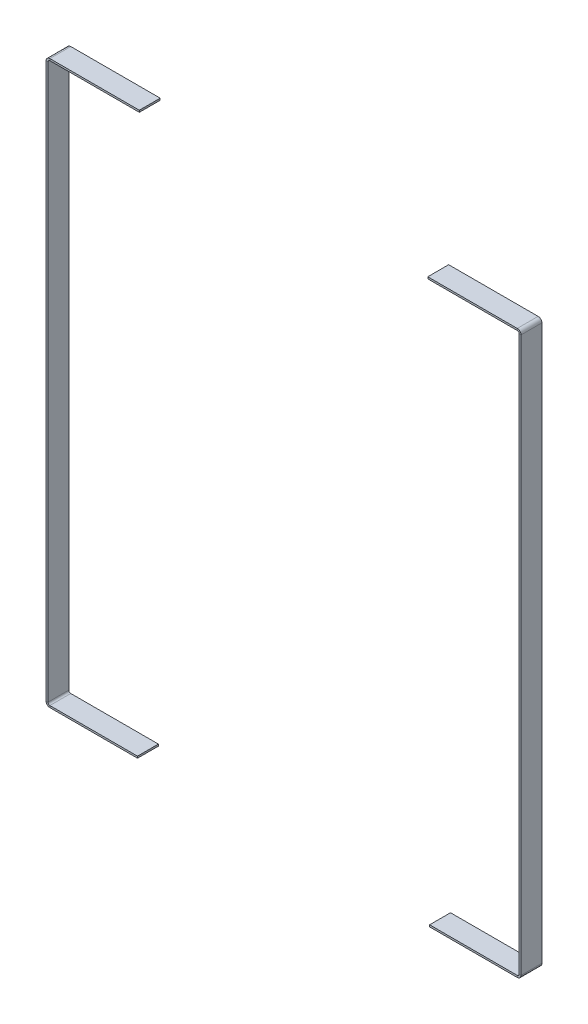
ISO-10303-21;
HEADER;
FILE_DESCRIPTION(('STEP AP214'),'2;1');
FILE_NAME('part.step','',(''),(''),'','','');
FILE_SCHEMA(('AUTOMOTIVE_DESIGN { 1 0 10303 214 1 1 1 1 }'));
ENDSEC;
DATA;
#1=APPLICATION_CONTEXT('core data for automotive mechanical design processes');
#2=APPLICATION_PROTOCOL_DEFINITION('international standard','automotive_design',2000,#1);
#3=PRODUCT_CONTEXT('',#1,'mechanical');
#4=PRODUCT('Part','Part','',(#3));
#5=PRODUCT_RELATED_PRODUCT_CATEGORY('part','',(#4));
#6=PRODUCT_DEFINITION_FORMATION('','',#4);
#7=PRODUCT_DEFINITION_CONTEXT('part definition',#1,'design');
#8=PRODUCT_DEFINITION('design','',#6,#7);
#9=PRODUCT_DEFINITION_SHAPE('','',#8);
#10=(LENGTH_UNIT() NAMED_UNIT(*) SI_UNIT(.MILLI.,.METRE.));
#11=(NAMED_UNIT(*) PLANE_ANGLE_UNIT() SI_UNIT($,.RADIAN.));
#12=(NAMED_UNIT(*) SI_UNIT($,.STERADIAN.) SOLID_ANGLE_UNIT());
#13=UNCERTAINTY_MEASURE_WITH_UNIT(LENGTH_MEASURE(1.E-05),#10,'distance_accuracy_value','');
#14=(GEOMETRIC_REPRESENTATION_CONTEXT(3) GLOBAL_UNCERTAINTY_ASSIGNED_CONTEXT((#13)) GLOBAL_UNIT_ASSIGNED_CONTEXT((#10,
#11,#12)) REPRESENTATION_CONTEXT('',''));
#15=CARTESIAN_POINT('',(0.,0.,0.));
#16=DIRECTION('',(0.,0.,1.));
#17=DIRECTION('',(1.,0.,0.));
#18=AXIS2_PLACEMENT_3D('',#15,#16,#17);
#19=CARTESIAN_POINT('',(118.212754397594,-97.4772081869041,103.673110700388));
#20=DIRECTION('',(0.,0.,-1.));
#21=DIRECTION('',(-1.,0.,0.));
#22=AXIS2_PLACEMENT_3D('',#19,#20,#21);
#23=PLANE('',#22);
#24=DIRECTION('',(1.,0.,0.));
#25=VECTOR('',#24,1.);
#26=CARTESIAN_POINT('',(118.212754397594,-97.4772081869041,103.673110700388));
#27=LINE('',#26,#25);
#28=CARTESIAN_POINT('',(262.946154397594,-97.4772081869041,103.673110700388));
#29=VERTEX_POINT('',#28);
#30=CARTESIAN_POINT('',(297.212754397594,-97.4772081869041,103.673110700388));
#31=VERTEX_POINT('',#30);
#32=EDGE_CURVE('E217',#29,#31,#27,.T.);
#33=ORIENTED_EDGE('',*,*,#32,.F.);
#34=DIRECTION('',(0.,1.,0.));
#35=VECTOR('',#34,1.);
#36=CARTESIAN_POINT('',(262.946154397594,-312.754808186904,103.673110700388));
#37=LINE('',#36,#35);
#38=CARTESIAN_POINT('',(262.946154397594,-98.1772081869041,103.673110700388));
#39=VERTEX_POINT('',#38);
#40=EDGE_CURVE('E132',#39,#29,#37,.T.);
#41=ORIENTED_EDGE('',*,*,#40,.F.);
#42=DIRECTION('',(1.,0.,0.));
#43=VECTOR('',#42,1.);
#44=CARTESIAN_POINT('',(118.212754397594,-98.1772081869041,103.673110700388));
#45=LINE('',#44,#43);
#46=CARTESIAN_POINT('',(297.212754397594,-98.1772081869041,103.673110700388));
#47=VERTEX_POINT('',#46);
#48=EDGE_CURVE('E126',#39,#47,#45,.T.);
#49=ORIENTED_EDGE('',*,*,#48,.T.);
#50=DIRECTION('',(0.,-1.,0.));
#51=VECTOR('',#50,1.);
#52=CARTESIAN_POINT('',(297.212754397594,-97.4772081869041,103.673110700388));
#53=LINE('',#52,#51);
#54=EDGE_CURVE('E223',#31,#47,#53,.T.);
#55=ORIENTED_EDGE('',*,*,#54,.F.);
#56=EDGE_LOOP('',(#33,#41,#49,#55));
#57=FACE_BOUND('',#56,.T.);
#58=ADVANCED_FACE('F123',(#57),#23,.F.);
#59=CARTESIAN_POINT('',(118.212754397594,-97.4772081869041,95.6731107003881));
#60=DIRECTION('',(0.,0.,1.));
#61=DIRECTION('',(1.,0.,0.));
#62=AXIS2_PLACEMENT_3D('',#59,#60,#61);
#63=PLANE('',#62);
#64=DIRECTION('',(-1.,0.,0.));
#65=VECTOR('',#64,1.);
#66=CARTESIAN_POINT('',(118.212754397594,-98.1772081869041,95.6731107003881));
#67=LINE('',#66,#65);
#68=CARTESIAN_POINT('',(297.212754397594,-98.1772081869041,95.6731107003881));
#69=VERTEX_POINT('',#68);
#70=CARTESIAN_POINT('',(262.946154397594,-98.1772081869041,95.6731107003881));
#71=VERTEX_POINT('',#70);
#72=EDGE_CURVE('E232',#69,#71,#67,.T.);
#73=ORIENTED_EDGE('',*,*,#72,.T.);
#74=DIRECTION('',(0.,1.,0.));
#75=VECTOR('',#74,1.);
#76=CARTESIAN_POINT('',(262.946154397594,-312.754808186904,95.6731107003881));
#77=LINE('',#76,#75);
#78=CARTESIAN_POINT('',(262.946154397594,-97.4772081869041,95.6731107003881));
#79=VERTEX_POINT('',#78);
#80=EDGE_CURVE('E139',#71,#79,#77,.T.);
#81=ORIENTED_EDGE('',*,*,#80,.T.);
#82=DIRECTION('',(-1.,0.,0.));
#83=VECTOR('',#82,1.);
#84=CARTESIAN_POINT('',(118.212754397594,-97.4772081869041,95.6731107003881));
#85=LINE('',#84,#83);
#86=CARTESIAN_POINT('',(297.212754397594,-97.4772081869041,95.6731107003881));
#87=VERTEX_POINT('',#86);
#88=EDGE_CURVE('E220',#87,#79,#85,.T.);
#89=ORIENTED_EDGE('',*,*,#88,.F.);
#90=DIRECTION('',(0.,-1.,0.));
#91=VECTOR('',#90,1.);
#92=CARTESIAN_POINT('',(297.212754397594,-97.4772081869041,95.6731107003881));
#93=LINE('',#92,#91);
#94=EDGE_CURVE('E225',#87,#69,#93,.T.);
#95=ORIENTED_EDGE('',*,*,#94,.T.);
#96=EDGE_LOOP('',(#73,#81,#89,#95));
#97=FACE_BOUND('',#96,.T.);
#98=ADVANCED_FACE('F379',(#97),#63,.F.);
#99=CARTESIAN_POINT('',(118.212754397594,-97.4772081869041,103.673110700388));
#100=DIRECTION('',(0.,1.,0.));
#101=DIRECTION('',(0.,0.,1.));
#102=AXIS2_PLACEMENT_3D('',#99,#100,#101);
#103=PLANE('',#102);
#104=DIRECTION('',(0.,0.,-1.));
#105=VECTOR('',#104,1.);
#106=CARTESIAN_POINT('',(262.946154397594,-97.4772081869041,95.6731107003881));
#107=LINE('',#106,#105);
#108=EDGE_CURVE('E14',#29,#79,#107,.T.);
#109=ORIENTED_EDGE('',*,*,#108,.F.);
#110=ORIENTED_EDGE('',*,*,#32,.T.);
#111=DIRECTION('',(0.,0.,-1.));
#112=VECTOR('',#111,1.);
#113=CARTESIAN_POINT('',(297.212754397594,-97.4772081869041,95.6731107003881));
#114=LINE('',#113,#112);
#115=EDGE_CURVE('E224',#31,#87,#114,.T.);
#116=ORIENTED_EDGE('',*,*,#115,.T.);
#117=ORIENTED_EDGE('',*,*,#88,.T.);
#118=EDGE_LOOP('',(#109,#110,#116,#117));
#119=FACE_BOUND('',#118,.T.);
#120=ADVANCED_FACE('F215',(#119),#103,.T.);
#121=CARTESIAN_POINT('',(118.212754397594,-98.1772081869041,103.673110700388));
#122=DIRECTION('',(0.,1.,0.));
#123=DIRECTION('',(0.,0.,1.));
#124=AXIS2_PLACEMENT_3D('',#121,#122,#123);
#125=PLANE('',#124);
#126=ORIENTED_EDGE('',*,*,#48,.F.);
#127=DIRECTION('',(0.,0.,1.));
#128=VECTOR('',#127,1.);
#129=CARTESIAN_POINT('',(262.946154397594,-98.1772081869041,95.6731107003881));
#130=LINE('',#129,#128);
#131=EDGE_CURVE('E208',#71,#39,#130,.T.);
#132=ORIENTED_EDGE('',*,*,#131,.F.);
#133=ORIENTED_EDGE('',*,*,#72,.F.);
#134=DIRECTION('',(0.,0.,-1.));
#135=VECTOR('',#134,1.);
#136=CARTESIAN_POINT('',(297.212754397594,-98.1772081869041,95.6731107003881));
#137=LINE('',#136,#135);
#138=EDGE_CURVE('E248',#47,#69,#137,.T.);
#139=ORIENTED_EDGE('',*,*,#138,.F.);
#140=EDGE_LOOP('',(#126,#132,#133,#139));
#141=FACE_BOUND('',#140,.T.);
#142=ADVANCED_FACE('F258',(#141),#125,.F.);
#143=CARTESIAN_POINT('',(297.212754397594,-98.913808186904,95.6731107003881));
#144=DIRECTION('',(0.,0.,-1.));
#145=DIRECTION('',(-1.,0.,0.));
#146=AXIS2_PLACEMENT_3D('',#143,#144,#145);
#147=PLANE('',#146);
#148=DIRECTION('',(1.,0.,0.));
#149=VECTOR('',#148,1.);
#150=CARTESIAN_POINT('',(298.649354397594,-98.913808186904,95.6731107003881));
#151=LINE('',#150,#149);
#152=CARTESIAN_POINT('',(297.949354397594,-98.913808186904,95.6731107003881));
#153=VERTEX_POINT('',#152);
#154=CARTESIAN_POINT('',(298.649354397594,-98.913808186904,95.6731107003881));
#155=VERTEX_POINT('',#154);
#156=EDGE_CURVE('E268',#153,#155,#151,.T.);
#157=ORIENTED_EDGE('',*,*,#156,.F.);
#158=CARTESIAN_POINT('',(297.212754397594,-98.913808186904,95.6731107003881));
#159=DIRECTION('',(0.,0.,1.));
#160=DIRECTION('',(1.,0.,0.));
#161=AXIS2_PLACEMENT_3D('',#158,#159,#160);
#162=CIRCLE('',#161,0.736599999999976);
#163=EDGE_CURVE('E259',#69,#153,#162,.F.);
#164=ORIENTED_EDGE('',*,*,#163,.F.);
#165=ORIENTED_EDGE('',*,*,#94,.F.);
#166=CARTESIAN_POINT('',(297.212754397594,-98.913808186904,95.6731107003881));
#167=DIRECTION('',(0.,0.,1.));
#168=DIRECTION('',(1.,0.,0.));
#169=AXIS2_PLACEMENT_3D('',#166,#167,#168);
#170=CIRCLE('',#169,1.43659999999998);
#171=EDGE_CURVE('E265',#87,#155,#170,.F.);
#172=ORIENTED_EDGE('',*,*,#171,.T.);
#173=EDGE_LOOP('',(#157,#164,#165,#172));
#174=FACE_BOUND('',#173,.T.);
#175=ADVANCED_FACE('F390',(#174),#147,.T.);
#176=CARTESIAN_POINT('',(297.212754397594,-98.913808186904,103.673110700388));
#177=DIRECTION('',(0.,0.,-1.));
#178=DIRECTION('',(-1.,0.,0.));
#179=AXIS2_PLACEMENT_3D('',#176,#177,#178);
#180=PLANE('',#179);
#181=CARTESIAN_POINT('',(297.212754397594,-98.913808186904,103.673110700388));
#182=DIRECTION('',(0.,0.,1.));
#183=DIRECTION('',(1.,0.,0.));
#184=AXIS2_PLACEMENT_3D('',#181,#182,#183);
#185=CIRCLE('',#184,0.736599999999976);
#186=CARTESIAN_POINT('',(297.949354397594,-98.913808186904,103.673110700388));
#187=VERTEX_POINT('',#186);
#188=EDGE_CURVE('E245',#187,#47,#185,.T.);
#189=ORIENTED_EDGE('',*,*,#188,.F.);
#190=DIRECTION('',(1.,0.,0.));
#191=VECTOR('',#190,1.);
#192=CARTESIAN_POINT('',(297.949354397594,-98.913808186904,103.673110700388));
#193=LINE('',#192,#191);
#194=CARTESIAN_POINT('',(298.649354397594,-98.913808186904,103.673110700388));
#195=VERTEX_POINT('',#194);
#196=EDGE_CURVE('E264',#187,#195,#193,.T.);
#197=ORIENTED_EDGE('',*,*,#196,.T.);
#198=CARTESIAN_POINT('',(297.212754397594,-98.913808186904,103.673110700388));
#199=DIRECTION('',(0.,0.,1.));
#200=DIRECTION('',(1.,0.,0.));
#201=AXIS2_PLACEMENT_3D('',#198,#199,#200);
#202=CIRCLE('',#201,1.43659999999998);
#203=EDGE_CURVE('E247',#195,#31,#202,.T.);
#204=ORIENTED_EDGE('',*,*,#203,.T.);
#205=ORIENTED_EDGE('',*,*,#54,.T.);
#206=EDGE_LOOP('',(#189,#197,#204,#205));
#207=FACE_BOUND('',#206,.T.);
#208=ADVANCED_FACE('F243',(#207),#180,.F.);
#209=CARTESIAN_POINT('',(297.212754397594,-98.913808186904,103.673110700388));
#210=DIRECTION('',(0.,0.,1.));
#211=DIRECTION('',(1.,0.,0.));
#212=AXIS2_PLACEMENT_3D('',#209,#210,#211);
#213=CYLINDRICAL_SURFACE('',#212,1.43659999999998);
#214=ORIENTED_EDGE('',*,*,#115,.F.);
#215=ORIENTED_EDGE('',*,*,#203,.F.);
#216=DIRECTION('',(0.,0.,1.));
#217=VECTOR('',#216,1.);
#218=CARTESIAN_POINT('',(298.649354397594,-98.913808186904,103.673110700388));
#219=LINE('',#218,#217);
#220=EDGE_CURVE('E274',#155,#195,#219,.T.);
#221=ORIENTED_EDGE('',*,*,#220,.F.);
#222=ORIENTED_EDGE('',*,*,#171,.F.);
#223=EDGE_LOOP('',(#214,#215,#221,#222));
#224=FACE_BOUND('',#223,.T.);
#225=ADVANCED_FACE('F526',(#224),#213,.T.);
#226=CARTESIAN_POINT('',(297.212754397594,-98.913808186904,103.673110700388));
#227=DIRECTION('',(0.,0.,1.));
#228=DIRECTION('',(1.,0.,0.));
#229=AXIS2_PLACEMENT_3D('',#226,#227,#228);
#230=CYLINDRICAL_SURFACE('',#229,0.736599999999976);
#231=ORIENTED_EDGE('',*,*,#138,.T.);
#232=ORIENTED_EDGE('',*,*,#163,.T.);
#233=DIRECTION('',(0.,0.,-1.));
#234=VECTOR('',#233,1.);
#235=CARTESIAN_POINT('',(297.949354397594,-98.913808186904,95.6731107003881));
#236=LINE('',#235,#234);
#237=EDGE_CURVE('E255',#153,#187,#236,.F.);
#238=ORIENTED_EDGE('',*,*,#237,.T.);
#239=ORIENTED_EDGE('',*,*,#188,.T.);
#240=EDGE_LOOP('',(#231,#232,#238,#239));
#241=FACE_BOUND('',#240,.T.);
#242=ADVANCED_FACE('F251',(#241),#230,.F.);
#243=CARTESIAN_POINT('',(298.649354397594,-98.1772081869041,103.673110700388));
#244=DIRECTION('',(0.,0.,1.));
#245=DIRECTION('',(1.,0.,0.));
#246=AXIS2_PLACEMENT_3D('',#243,#244,#245);
#247=PLANE('',#246);
#248=DIRECTION('',(0.,1.,0.));
#249=VECTOR('',#248,1.);
#250=CARTESIAN_POINT('',(298.649354397594,-98.1772081869041,103.673110700388));
#251=LINE('',#250,#249);
#252=CARTESIAN_POINT('',(298.649354397595,-311.317208186904,103.673110700388));
#253=VERTEX_POINT('',#252);
#254=EDGE_CURVE('E256',#253,#195,#251,.T.);
#255=ORIENTED_EDGE('',*,*,#254,.T.);
#256=ORIENTED_EDGE('',*,*,#196,.F.);
#257=DIRECTION('',(0.,-1.,0.));
#258=VECTOR('',#257,1.);
#259=CARTESIAN_POINT('',(297.949354397594,-98.1772081869041,103.673110700388));
#260=LINE('',#259,#258);
#261=CARTESIAN_POINT('',(297.949354397595,-311.317208186904,103.673110700388));
#262=VERTEX_POINT('',#261);
#263=EDGE_CURVE('E282',#262,#187,#260,.F.);
#264=ORIENTED_EDGE('',*,*,#263,.F.);
#265=DIRECTION('',(-1.,0.,0.));
#266=VECTOR('',#265,1.);
#267=CARTESIAN_POINT('',(298.649354397595,-311.317208186904,103.673110700388));
#268=LINE('',#267,#266);
#269=EDGE_CURVE('E290',#253,#262,#268,.T.);
#270=ORIENTED_EDGE('',*,*,#269,.F.);
#271=EDGE_LOOP('',(#255,#256,#264,#270));
#272=FACE_BOUND('',#271,.T.);
#273=ADVANCED_FACE('F505',(#272),#247,.T.);
#274=CARTESIAN_POINT('',(298.649354397595,-311.317208186904,95.6731107003881));
#275=DIRECTION('',(0.,0.,-1.));
#276=DIRECTION('',(0.,1.,0.));
#277=AXIS2_PLACEMENT_3D('',#274,#275,#276);
#278=PLANE('',#277);
#279=DIRECTION('',(0.,1.,0.));
#280=VECTOR('',#279,1.);
#281=CARTESIAN_POINT('',(297.949354397594,-98.1772081869041,95.6731107003881));
#282=LINE('',#281,#280);
#283=CARTESIAN_POINT('',(297.949354397595,-311.317208186904,95.6731107003881));
#284=VERTEX_POINT('',#283);
#285=EDGE_CURVE('E277',#153,#284,#282,.F.);
#286=ORIENTED_EDGE('',*,*,#285,.F.);
#287=ORIENTED_EDGE('',*,*,#156,.T.);
#288=DIRECTION('',(0.,-1.,0.));
#289=VECTOR('',#288,1.);
#290=CARTESIAN_POINT('',(298.649354397595,-311.317208186904,95.6731107003881));
#291=LINE('',#290,#289);
#292=CARTESIAN_POINT('',(298.649354397595,-311.317208186904,95.6731107003881));
#293=VERTEX_POINT('',#292);
#294=EDGE_CURVE('E271',#155,#293,#291,.T.);
#295=ORIENTED_EDGE('',*,*,#294,.T.);
#296=DIRECTION('',(-1.,0.,0.));
#297=VECTOR('',#296,1.);
#298=CARTESIAN_POINT('',(298.649354397595,-311.317208186904,95.6731107003881));
#299=LINE('',#298,#297);
#300=EDGE_CURVE('E278',#293,#284,#299,.T.);
#301=ORIENTED_EDGE('',*,*,#300,.T.);
#302=EDGE_LOOP('',(#286,#287,#295,#301));
#303=FACE_BOUND('',#302,.T.);
#304=ADVANCED_FACE('F494',(#303),#278,.T.);
#305=CARTESIAN_POINT('',(298.649354397594,-98.1772081869041,103.673110700388));
#306=DIRECTION('',(1.,0.,0.));
#307=DIRECTION('',(0.,1.,0.));
#308=AXIS2_PLACEMENT_3D('',#305,#306,#307);
#309=PLANE('',#308);
#310=ORIENTED_EDGE('',*,*,#294,.F.);
#311=ORIENTED_EDGE('',*,*,#220,.T.);
#312=ORIENTED_EDGE('',*,*,#254,.F.);
#313=DIRECTION('',(0.,0.,1.));
#314=VECTOR('',#313,1.);
#315=CARTESIAN_POINT('',(298.649354397595,-311.317208186904,103.673110700388));
#316=LINE('',#315,#314);
#317=EDGE_CURVE('E286',#293,#253,#316,.T.);
#318=ORIENTED_EDGE('',*,*,#317,.F.);
#319=EDGE_LOOP('',(#310,#311,#312,#318));
#320=FACE_BOUND('',#319,.T.);
#321=ADVANCED_FACE('F483',(#320),#309,.T.);
#322=CARTESIAN_POINT('',(297.949354397594,-98.1772081869041,103.673110700388));
#323=DIRECTION('',(1.,0.,0.));
#324=DIRECTION('',(0.,1.,0.));
#325=AXIS2_PLACEMENT_3D('',#322,#323,#324);
#326=PLANE('',#325);
#327=ORIENTED_EDGE('',*,*,#237,.F.);
#328=ORIENTED_EDGE('',*,*,#285,.T.);
#329=DIRECTION('',(0.,0.,-1.));
#330=VECTOR('',#329,1.);
#331=CARTESIAN_POINT('',(297.949354397595,-311.317208186904,103.673110700388));
#332=LINE('',#331,#330);
#333=EDGE_CURVE('E280',#284,#262,#332,.F.);
#334=ORIENTED_EDGE('',*,*,#333,.T.);
#335=ORIENTED_EDGE('',*,*,#263,.T.);
#336=EDGE_LOOP('',(#327,#328,#334,#335));
#337=FACE_BOUND('',#336,.T.);
#338=ADVANCED_FACE('F473',(#337),#326,.F.);
#339=CARTESIAN_POINT('',(297.212754397595,-311.317208186904,95.6731107003881));
#340=DIRECTION('',(0.,0.,-1.));
#341=DIRECTION('',(-1.,0.,0.));
#342=AXIS2_PLACEMENT_3D('',#339,#340,#341);
#343=PLANE('',#342);
#344=DIRECTION('',(0.,-1.,0.));
#345=VECTOR('',#344,1.);
#346=CARTESIAN_POINT('',(297.212754397595,-312.753808186904,95.6731107003881));
#347=LINE('',#346,#345);
#348=CARTESIAN_POINT('',(297.212754397595,-312.053808186904,95.6731107003881));
#349=VERTEX_POINT('',#348);
#350=CARTESIAN_POINT('',(297.212754397595,-312.753808186904,95.6731107003881));
#351=VERTEX_POINT('',#350);
#352=EDGE_CURVE('E310',#349,#351,#347,.T.);
#353=ORIENTED_EDGE('',*,*,#352,.F.);
#354=CARTESIAN_POINT('',(297.212754397595,-311.317208186904,95.6731107003881));
#355=DIRECTION('',(0.,0.,1.));
#356=DIRECTION('',(1.,0.,0.));
#357=AXIS2_PLACEMENT_3D('',#354,#355,#356);
#358=CIRCLE('',#357,0.736599999999976);
#359=EDGE_CURVE('E289',#284,#349,#358,.F.);
#360=ORIENTED_EDGE('',*,*,#359,.F.);
#361=ORIENTED_EDGE('',*,*,#300,.F.);
#362=CARTESIAN_POINT('',(297.212754397595,-311.317208186904,95.6731107003881));
#363=DIRECTION('',(0.,0.,1.));
#364=DIRECTION('',(1.,0.,0.));
#365=AXIS2_PLACEMENT_3D('',#362,#363,#364);
#366=CIRCLE('',#365,1.43659999999998);
#367=EDGE_CURVE('E284',#293,#351,#366,.F.);
#368=ORIENTED_EDGE('',*,*,#367,.T.);
#369=EDGE_LOOP('',(#353,#360,#361,#368));
#370=FACE_BOUND('',#369,.T.);
#371=ADVANCED_FACE('F363',(#370),#343,.T.);
#372=CARTESIAN_POINT('',(297.212754397595,-311.317208186904,103.673110700388));
#373=DIRECTION('',(0.,0.,-1.));
#374=DIRECTION('',(-1.,0.,0.));
#375=AXIS2_PLACEMENT_3D('',#372,#373,#374);
#376=PLANE('',#375);
#377=CARTESIAN_POINT('',(297.212754397595,-311.317208186904,103.673110700388));
#378=DIRECTION('',(0.,0.,1.));
#379=DIRECTION('',(1.,0.,0.));
#380=AXIS2_PLACEMENT_3D('',#377,#378,#379);
#381=CIRCLE('',#380,0.736599999999976);
#382=CARTESIAN_POINT('',(297.212754397595,-312.053808186904,103.673110700388));
#383=VERTEX_POINT('',#382);
#384=EDGE_CURVE('E298',#383,#262,#381,.T.);
#385=ORIENTED_EDGE('',*,*,#384,.F.);
#386=DIRECTION('',(0.,-1.,0.));
#387=VECTOR('',#386,1.);
#388=CARTESIAN_POINT('',(297.212754397595,-312.053808186904,103.673110700388));
#389=LINE('',#388,#387);
#390=CARTESIAN_POINT('',(297.212754397595,-312.753808186904,103.673110700388));
#391=VERTEX_POINT('',#390);
#392=EDGE_CURVE('E307',#383,#391,#389,.T.);
#393=ORIENTED_EDGE('',*,*,#392,.T.);
#394=CARTESIAN_POINT('',(297.212754397595,-311.317208186904,103.673110700388));
#395=DIRECTION('',(0.,0.,1.));
#396=DIRECTION('',(1.,0.,0.));
#397=AXIS2_PLACEMENT_3D('',#394,#395,#396);
#398=CIRCLE('',#397,1.43659999999998);
#399=EDGE_CURVE('E297',#391,#253,#398,.T.);
#400=ORIENTED_EDGE('',*,*,#399,.T.);
#401=ORIENTED_EDGE('',*,*,#269,.T.);
#402=EDGE_LOOP('',(#385,#393,#400,#401));
#403=FACE_BOUND('',#402,.T.);
#404=ADVANCED_FACE('F354',(#403),#376,.F.);
#405=CARTESIAN_POINT('',(297.212754397595,-311.317208186904,103.673110700388));
#406=DIRECTION('',(0.,0.,1.));
#407=DIRECTION('',(0.,-1.,0.));
#408=AXIS2_PLACEMENT_3D('',#405,#406,#407);
#409=CYLINDRICAL_SURFACE('',#408,1.43659999999998);
#410=ORIENTED_EDGE('',*,*,#317,.T.);
#411=ORIENTED_EDGE('',*,*,#399,.F.);
#412=DIRECTION('',(0.,0.,1.));
#413=VECTOR('',#412,1.);
#414=CARTESIAN_POINT('',(297.212754397595,-312.753808186904,103.673110700388));
#415=LINE('',#414,#413);
#416=EDGE_CURVE('E317',#351,#391,#415,.T.);
#417=ORIENTED_EDGE('',*,*,#416,.F.);
#418=ORIENTED_EDGE('',*,*,#367,.F.);
#419=EDGE_LOOP('',(#410,#411,#417,#418));
#420=FACE_BOUND('',#419,.T.);
#421=ADVANCED_FACE('F360',(#420),#409,.T.);
#422=CARTESIAN_POINT('',(297.212754397595,-311.317208186904,103.673110700388));
#423=DIRECTION('',(0.,0.,1.));
#424=DIRECTION('',(0.,-1.,0.));
#425=AXIS2_PLACEMENT_3D('',#422,#423,#424);
#426=CYLINDRICAL_SURFACE('',#425,0.736599999999976);
#427=ORIENTED_EDGE('',*,*,#333,.F.);
#428=ORIENTED_EDGE('',*,*,#359,.T.);
#429=DIRECTION('',(0.,0.,-1.));
#430=VECTOR('',#429,1.);
#431=CARTESIAN_POINT('',(297.212754397595,-312.053808186904,95.6731107003881));
#432=LINE('',#431,#430);
#433=EDGE_CURVE('E302',#349,#383,#432,.F.);
#434=ORIENTED_EDGE('',*,*,#433,.T.);
#435=ORIENTED_EDGE('',*,*,#384,.T.);
#436=EDGE_LOOP('',(#427,#428,#434,#435));
#437=FACE_BOUND('',#436,.T.);
#438=ADVANCED_FACE('F374',(#437),#426,.F.);
#439=CARTESIAN_POINT('',(297.949354397595,-312.753808186904,103.673110700388));
#440=DIRECTION('',(0.,0.,1.));
#441=DIRECTION('',(1.,0.,0.));
#442=AXIS2_PLACEMENT_3D('',#439,#440,#441);
#443=PLANE('',#442);
#444=DIRECTION('',(1.,0.,0.));
#445=VECTOR('',#444,1.);
#446=CARTESIAN_POINT('',(297.949354397595,-312.753808186904,103.673110700388));
#447=LINE('',#446,#445);
#448=CARTESIAN_POINT('',(263.649354397595,-312.753808186904,103.673110700388));
#449=VERTEX_POINT('',#448);
#450=EDGE_CURVE('E301',#449,#391,#447,.T.);
#451=ORIENTED_EDGE('',*,*,#450,.T.);
#452=ORIENTED_EDGE('',*,*,#392,.F.);
#453=DIRECTION('',(-1.,0.,0.));
#454=VECTOR('',#453,1.);
#455=CARTESIAN_POINT('',(297.949354397595,-312.053808186904,103.673110700388));
#456=LINE('',#455,#454);
#457=CARTESIAN_POINT('',(263.649354397595,-312.053808186904,103.673110700388));
#458=VERTEX_POINT('',#457);
#459=EDGE_CURVE('E326',#458,#383,#456,.F.);
#460=ORIENTED_EDGE('',*,*,#459,.F.);
#461=DIRECTION('',(0.,1.,0.));
#462=VECTOR('',#461,1.);
#463=CARTESIAN_POINT('',(263.649354397595,-312.753808186904,103.673110700388));
#464=LINE('',#463,#462);
#465=EDGE_CURVE('E333',#449,#458,#464,.T.);
#466=ORIENTED_EDGE('',*,*,#465,.F.);
#467=EDGE_LOOP('',(#451,#452,#460,#466));
#468=FACE_BOUND('',#467,.T.);
#469=ADVANCED_FACE('F351',(#468),#443,.T.);
#470=CARTESIAN_POINT('',(263.649354397595,-312.753808186904,95.6731107003881));
#471=DIRECTION('',(0.,0.,-1.));
#472=DIRECTION('',(-1.,0.,0.));
#473=AXIS2_PLACEMENT_3D('',#470,#471,#472);
#474=PLANE('',#473);
#475=DIRECTION('',(1.,0.,0.));
#476=VECTOR('',#475,1.);
#477=CARTESIAN_POINT('',(297.949354397595,-312.053808186904,95.6731107003881));
#478=LINE('',#477,#476);
#479=CARTESIAN_POINT('',(263.649354397595,-312.053808186904,95.6731107003881));
#480=VERTEX_POINT('',#479);
#481=EDGE_CURVE('E320',#349,#480,#478,.F.);
#482=ORIENTED_EDGE('',*,*,#481,.F.);
#483=ORIENTED_EDGE('',*,*,#352,.T.);
#484=DIRECTION('',(-1.,0.,0.));
#485=VECTOR('',#484,1.);
#486=CARTESIAN_POINT('',(263.649354397595,-312.753808186904,95.6731107003881));
#487=LINE('',#486,#485);
#488=CARTESIAN_POINT('',(263.649354397595,-312.753808186904,95.6731107003881));
#489=VERTEX_POINT('',#488);
#490=EDGE_CURVE('E313',#351,#489,#487,.T.);
#491=ORIENTED_EDGE('',*,*,#490,.T.);
#492=DIRECTION('',(0.,1.,0.));
#493=VECTOR('',#492,1.);
#494=CARTESIAN_POINT('',(263.649354397595,-312.753808186904,95.6731107003881));
#495=LINE('',#494,#493);
#496=EDGE_CURVE('E321',#489,#480,#495,.T.);
#497=ORIENTED_EDGE('',*,*,#496,.T.);
#498=EDGE_LOOP('',(#482,#483,#491,#497));
#499=FACE_BOUND('',#498,.T.);
#500=ADVANCED_FACE('F366',(#499),#474,.T.);
#501=CARTESIAN_POINT('',(297.949354397595,-312.753808186904,103.673110700388));
#502=DIRECTION('',(0.,-1.,0.));
#503=DIRECTION('',(1.,0.,0.));
#504=AXIS2_PLACEMENT_3D('',#501,#502,#503);
#505=PLANE('',#504);
#506=ORIENTED_EDGE('',*,*,#490,.F.);
#507=ORIENTED_EDGE('',*,*,#416,.T.);
#508=ORIENTED_EDGE('',*,*,#450,.F.);
#509=DIRECTION('',(0.,0.,1.));
#510=VECTOR('',#509,1.);
#511=CARTESIAN_POINT('',(263.649354397595,-312.753808186904,103.673110700388));
#512=LINE('',#511,#510);
#513=EDGE_CURVE('E329',#489,#449,#512,.T.);
#514=ORIENTED_EDGE('',*,*,#513,.F.);
#515=EDGE_LOOP('',(#506,#507,#508,#514));
#516=FACE_BOUND('',#515,.T.);
#517=ADVANCED_FACE('F357',(#516),#505,.T.);
#518=CARTESIAN_POINT('',(297.949354397595,-312.053808186904,103.673110700388));
#519=DIRECTION('',(0.,-1.,0.));
#520=DIRECTION('',(1.,0.,0.));
#521=AXIS2_PLACEMENT_3D('',#518,#519,#520);
#522=PLANE('',#521);
#523=ORIENTED_EDGE('',*,*,#433,.F.);
#524=ORIENTED_EDGE('',*,*,#481,.T.);
#525=DIRECTION('',(0.,0.,-1.));
#526=VECTOR('',#525,1.);
#527=CARTESIAN_POINT('',(263.649354397595,-312.053808186904,103.673110700388));
#528=LINE('',#527,#526);
#529=EDGE_CURVE('E323',#480,#458,#528,.F.);
#530=ORIENTED_EDGE('',*,*,#529,.T.);
#531=ORIENTED_EDGE('',*,*,#459,.T.);
#532=EDGE_LOOP('',(#523,#524,#530,#531));
#533=FACE_BOUND('',#532,.T.);
#534=ADVANCED_FACE('F348',(#533),#522,.F.);
#535=CARTESIAN_POINT('',(263.649354397595,-312.753808186904,103.673110700388));
#536=DIRECTION('',(-1.,0.,0.));
#537=DIRECTION('',(0.,-1.,0.));
#538=AXIS2_PLACEMENT_3D('',#535,#536,#537);
#539=PLANE('',#538);
#540=ORIENTED_EDGE('',*,*,#529,.F.);
#541=ORIENTED_EDGE('',*,*,#496,.F.);
#542=ORIENTED_EDGE('',*,*,#513,.T.);
#543=ORIENTED_EDGE('',*,*,#465,.T.);
#544=EDGE_LOOP('',(#540,#541,#542,#543));
#545=FACE_BOUND('',#544,.T.);
#546=ADVANCED_FACE('F340',(#545),#539,.T.);
#547=CARTESIAN_POINT('',(262.946154397594,-312.754808186904,95.6731107003881));
#548=DIRECTION('',(1.,0.,0.));
#549=DIRECTION('',(0.,0.,-1.));
#550=AXIS2_PLACEMENT_3D('',#547,#548,#549);
#551=PLANE('',#550);
#552=ORIENTED_EDGE('',*,*,#131,.T.);
#553=ORIENTED_EDGE('',*,*,#40,.T.);
#554=ORIENTED_EDGE('',*,*,#108,.T.);
#555=ORIENTED_EDGE('',*,*,#80,.F.);
#556=EDGE_LOOP('',(#552,#553,#554,#555));
#557=FACE_BOUND('',#556,.T.);
#558=ADVANCED_FACE('F207',(#557),#551,.F.);
#559=CLOSED_SHELL('',(#58,#98,#120,#142,#175,#208,#225,#242,#273,#304,#321,#338,#371,#404,#421,
#438,#469,#500,#517,#534,#546,#558));
#560=MANIFOLD_SOLID_BREP('B2',#559);
#561=CARTESIAN_POINT('',(151.776154397594,-312.753808186904,95.6731107003881));
#562=DIRECTION('',(1.,0.,0.));
#563=DIRECTION('',(0.,1.,0.));
#564=AXIS2_PLACEMENT_3D('',#561,#562,#563);
#565=PLANE('',#564);
#566=DIRECTION('',(0.,0.,1.));
#567=VECTOR('',#566,1.);
#568=CARTESIAN_POINT('',(151.776154397594,-312.053808186904,95.6731107003881));
#569=LINE('',#568,#567);
#570=CARTESIAN_POINT('',(151.776154397594,-312.053808186904,103.673110700388));
#571=VERTEX_POINT('',#570);
#572=CARTESIAN_POINT('',(151.776154397594,-312.053808186904,95.6731107003881));
#573=VERTEX_POINT('',#572);
#574=EDGE_CURVE('E799',#571,#573,#569,.F.);
#575=ORIENTED_EDGE('',*,*,#574,.F.);
#576=DIRECTION('',(0.,1.,0.));
#577=VECTOR('',#576,1.);
#578=CARTESIAN_POINT('',(151.776154397594,-312.753808186904,103.673110700388));
#579=LINE('',#578,#577);
#580=CARTESIAN_POINT('',(151.776154397594,-312.753808186904,103.673110700388));
#581=VERTEX_POINT('',#580);
#582=EDGE_CURVE('E813',#581,#571,#579,.T.);
#583=ORIENTED_EDGE('',*,*,#582,.F.);
#584=DIRECTION('',(0.,0.,-1.));
#585=VECTOR('',#584,1.);
#586=CARTESIAN_POINT('',(151.776154397594,-312.753808186904,95.6731107003881));
#587=LINE('',#586,#585);
#588=CARTESIAN_POINT('',(151.776154397594,-312.753808186904,95.6731107003881));
#589=VERTEX_POINT('',#588);
#590=EDGE_CURVE('E807',#581,#589,#587,.T.);
#591=ORIENTED_EDGE('',*,*,#590,.T.);
#592=DIRECTION('',(0.,1.,0.));
#593=VECTOR('',#592,1.);
#594=CARTESIAN_POINT('',(151.776154397594,-312.753808186904,95.6731107003881));
#595=LINE('',#594,#593);
#596=EDGE_CURVE('E778',#589,#573,#595,.T.);
#597=ORIENTED_EDGE('',*,*,#596,.T.);
#598=EDGE_LOOP('',(#575,#583,#591,#597));
#599=FACE_BOUND('',#598,.T.);
#600=ADVANCED_FACE('F611',(#599),#565,.T.);
#601=CARTESIAN_POINT('',(151.776154397594,-312.753808186904,103.673110700388));
#602=DIRECTION('',(0.,0.,1.));
#603=DIRECTION('',(1.,0.,0.));
#604=AXIS2_PLACEMENT_3D('',#601,#602,#603);
#605=PLANE('',#604);
#606=DIRECTION('',(-1.,0.,0.));
#607=VECTOR('',#606,1.);
#608=CARTESIAN_POINT('',(117.476154397594,-312.053808186904,103.673110700388));
#609=LINE('',#608,#607);
#610=CARTESIAN_POINT('',(118.212754397593,-312.053808186904,103.673110700388));
#611=VERTEX_POINT('',#610);
#612=EDGE_CURVE('E797',#611,#571,#609,.F.);
#613=ORIENTED_EDGE('',*,*,#612,.F.);
#614=DIRECTION('',(0.,-1.,0.));
#615=VECTOR('',#614,1.);
#616=CARTESIAN_POINT('',(118.212754397593,-312.753808186904,103.673110700388));
#617=LINE('',#616,#615);
#618=CARTESIAN_POINT('',(118.212754397593,-312.753808186904,103.673110700388));
#619=VERTEX_POINT('',#618);
#620=EDGE_CURVE('E786',#611,#619,#617,.T.);
#621=ORIENTED_EDGE('',*,*,#620,.T.);
#622=DIRECTION('',(1.,0.,0.));
#623=VECTOR('',#622,1.);
#624=CARTESIAN_POINT('',(151.776154397594,-312.753808186904,103.673110700388));
#625=LINE('',#624,#623);
#626=EDGE_CURVE('E805',#619,#581,#625,.T.);
#627=ORIENTED_EDGE('',*,*,#626,.T.);
#628=ORIENTED_EDGE('',*,*,#582,.T.);
#629=EDGE_LOOP('',(#613,#621,#627,#628));
#630=FACE_BOUND('',#629,.T.);
#631=ADVANCED_FACE('F860',(#630),#605,.T.);
#632=CARTESIAN_POINT('',(117.476154397594,-312.753808186904,95.6731107003881));
#633=DIRECTION('',(0.,0.,-1.));
#634=DIRECTION('',(-1.,0.,0.));
#635=AXIS2_PLACEMENT_3D('',#632,#633,#634);
#636=PLANE('',#635);
#637=DIRECTION('',(-1.,0.,0.));
#638=VECTOR('',#637,1.);
#639=CARTESIAN_POINT('',(117.476154397594,-312.753808186904,95.6731107003881));
#640=LINE('',#639,#638);
#641=CARTESIAN_POINT('',(118.212754397593,-312.753808186904,95.6731107003881));
#642=VERTEX_POINT('',#641);
#643=EDGE_CURVE('E810',#589,#642,#640,.T.);
#644=ORIENTED_EDGE('',*,*,#643,.T.);
#645=DIRECTION('',(0.,-1.,0.));
#646=VECTOR('',#645,1.);
#647=CARTESIAN_POINT('',(118.212754397593,-312.053808186904,95.6731107003881));
#648=LINE('',#647,#646);
#649=CARTESIAN_POINT('',(118.212754397593,-312.053808186904,95.6731107003881));
#650=VERTEX_POINT('',#649);
#651=EDGE_CURVE('E791',#650,#642,#648,.T.);
#652=ORIENTED_EDGE('',*,*,#651,.F.);
#653=DIRECTION('',(1.,0.,0.));
#654=VECTOR('',#653,1.);
#655=CARTESIAN_POINT('',(117.476154397594,-312.053808186904,95.6731107003881));
#656=LINE('',#655,#654);
#657=EDGE_CURVE('E802',#573,#650,#656,.F.);
#658=ORIENTED_EDGE('',*,*,#657,.F.);
#659=ORIENTED_EDGE('',*,*,#596,.F.);
#660=EDGE_LOOP('',(#644,#652,#658,#659));
#661=FACE_BOUND('',#660,.T.);
#662=ADVANCED_FACE('F853',(#661),#636,.T.);
#663=CARTESIAN_POINT('',(117.476154397594,-312.753808186904,95.6731107003881));
#664=DIRECTION('',(0.,-1.,0.));
#665=DIRECTION('',(1.,0.,0.));
#666=AXIS2_PLACEMENT_3D('',#663,#664,#665);
#667=PLANE('',#666);
#668=ORIENTED_EDGE('',*,*,#626,.F.);
#669=DIRECTION('',(0.,0.,-1.));
#670=VECTOR('',#669,1.);
#671=CARTESIAN_POINT('',(118.212754397593,-312.753808186904,95.6731107003881));
#672=LINE('',#671,#670);
#673=EDGE_CURVE('E794',#619,#642,#672,.T.);
#674=ORIENTED_EDGE('',*,*,#673,.T.);
#675=ORIENTED_EDGE('',*,*,#643,.F.);
#676=ORIENTED_EDGE('',*,*,#590,.F.);
#677=EDGE_LOOP('',(#668,#674,#675,#676));
#678=FACE_BOUND('',#677,.T.);
#679=ADVANCED_FACE('F849',(#678),#667,.T.);
#680=CARTESIAN_POINT('',(117.476154397594,-312.053808186904,95.6731107003881));
#681=DIRECTION('',(0.,-1.,0.));
#682=DIRECTION('',(1.,0.,0.));
#683=AXIS2_PLACEMENT_3D('',#680,#681,#682);
#684=PLANE('',#683);
#685=DIRECTION('',(0.,0.,1.));
#686=VECTOR('',#685,1.);
#687=CARTESIAN_POINT('',(118.212754397593,-312.053808186904,103.673110700388));
#688=LINE('',#687,#686);
#689=EDGE_CURVE('E789',#611,#650,#688,.F.);
#690=ORIENTED_EDGE('',*,*,#689,.F.);
#691=ORIENTED_EDGE('',*,*,#612,.T.);
#692=ORIENTED_EDGE('',*,*,#574,.T.);
#693=ORIENTED_EDGE('',*,*,#657,.T.);
#694=EDGE_LOOP('',(#690,#691,#692,#693));
#695=FACE_BOUND('',#694,.T.);
#696=ADVANCED_FACE('F866',(#695),#684,.F.);
#697=CARTESIAN_POINT('',(118.212754397593,-311.317208186904,103.673110700388));
#698=DIRECTION('',(0.,0.,1.));
#699=DIRECTION('',(1.,0.,0.));
#700=AXIS2_PLACEMENT_3D('',#697,#698,#699);
#701=PLANE('',#700);
#702=ORIENTED_EDGE('',*,*,#620,.F.);
#703=CARTESIAN_POINT('',(118.212754397593,-311.317208186904,103.673110700388));
#704=DIRECTION('',(0.,0.,-1.));
#705=DIRECTION('',(-1.,0.,0.));
#706=AXIS2_PLACEMENT_3D('',#703,#704,#705);
#707=CIRCLE('',#706,0.736599999999976);
#708=CARTESIAN_POINT('',(117.476154397594,-311.317208186904,103.673110700388));
#709=VERTEX_POINT('',#708);
#710=EDGE_CURVE('E777',#709,#611,#707,.F.);
#711=ORIENTED_EDGE('',*,*,#710,.F.);
#712=DIRECTION('',(1.,0.,0.));
#713=VECTOR('',#712,1.);
#714=CARTESIAN_POINT('',(116.776154397593,-311.317208186904,103.673110700388));
#715=LINE('',#714,#713);
#716=CARTESIAN_POINT('',(116.776154397593,-311.317208186904,103.673110700388));
#717=VERTEX_POINT('',#716);
#718=EDGE_CURVE('E769',#717,#709,#715,.T.);
#719=ORIENTED_EDGE('',*,*,#718,.F.);
#720=CARTESIAN_POINT('',(118.212754397593,-311.317208186904,103.673110700388));
#721=DIRECTION('',(0.,0.,-1.));
#722=DIRECTION('',(-1.,0.,0.));
#723=AXIS2_PLACEMENT_3D('',#720,#721,#722);
#724=CIRCLE('',#723,1.43659999999998);
#725=EDGE_CURVE('E746',#717,#619,#724,.F.);
#726=ORIENTED_EDGE('',*,*,#725,.T.);
#727=EDGE_LOOP('',(#702,#711,#719,#726));
#728=FACE_BOUND('',#727,.T.);
#729=ADVANCED_FACE('F843',(#728),#701,.T.);
#730=CARTESIAN_POINT('',(118.212754397593,-311.317208186904,95.6731107003881));
#731=DIRECTION('',(0.,0.,1.));
#732=DIRECTION('',(1.,0.,0.));
#733=AXIS2_PLACEMENT_3D('',#730,#731,#732);
#734=PLANE('',#733);
#735=CARTESIAN_POINT('',(118.212754397593,-311.317208186904,95.6731107003881));
#736=DIRECTION('',(0.,0.,-1.));
#737=DIRECTION('',(-1.,0.,0.));
#738=AXIS2_PLACEMENT_3D('',#735,#736,#737);
#739=CIRCLE('',#738,0.736599999999976);
#740=CARTESIAN_POINT('',(117.476154397594,-311.317208186904,95.6731107003881));
#741=VERTEX_POINT('',#740);
#742=EDGE_CURVE('E774',#650,#741,#739,.T.);
#743=ORIENTED_EDGE('',*,*,#742,.F.);
#744=ORIENTED_EDGE('',*,*,#651,.T.);
#745=CARTESIAN_POINT('',(118.212754397593,-311.317208186904,95.6731107003881));
#746=DIRECTION('',(0.,0.,-1.));
#747=DIRECTION('',(-1.,0.,0.));
#748=AXIS2_PLACEMENT_3D('',#745,#746,#747);
#749=CIRCLE('',#748,1.43659999999998);
#750=CARTESIAN_POINT('',(116.776154397594,-311.317208186904,95.6731107003881));
#751=VERTEX_POINT('',#750);
#752=EDGE_CURVE('E781',#642,#751,#749,.T.);
#753=ORIENTED_EDGE('',*,*,#752,.T.);
#754=DIRECTION('',(1.,0.,0.));
#755=VECTOR('',#754,1.);
#756=CARTESIAN_POINT('',(116.776154397593,-311.317208186904,95.6731107003881));
#757=LINE('',#756,#755);
#758=EDGE_CURVE('E735',#751,#741,#757,.T.);
#759=ORIENTED_EDGE('',*,*,#758,.T.);
#760=EDGE_LOOP('',(#743,#744,#753,#759));
#761=FACE_BOUND('',#760,.T.);
#762=ADVANCED_FACE('F873',(#761),#734,.F.);
#763=CARTESIAN_POINT('',(118.212754397593,-311.317208186904,95.6731107003881));
#764=DIRECTION('',(0.,0.,-1.));
#765=DIRECTION('',(0.,-1.,0.));
#766=AXIS2_PLACEMENT_3D('',#763,#764,#765);
#767=CYLINDRICAL_SURFACE('',#766,1.43659999999998);
#768=DIRECTION('',(0.,0.,-1.));
#769=VECTOR('',#768,1.);
#770=CARTESIAN_POINT('',(116.776154397593,-311.317208186904,95.6731107003881));
#771=LINE('',#770,#769);
#772=EDGE_CURVE('E763',#717,#751,#771,.T.);
#773=ORIENTED_EDGE('',*,*,#772,.T.);
#774=ORIENTED_EDGE('',*,*,#752,.F.);
#775=ORIENTED_EDGE('',*,*,#673,.F.);
#776=ORIENTED_EDGE('',*,*,#725,.F.);
#777=EDGE_LOOP('',(#773,#774,#775,#776));
#778=FACE_BOUND('',#777,.T.);
#779=ADVANCED_FACE('F845',(#778),#767,.T.);
#780=CARTESIAN_POINT('',(118.212754397593,-311.317208186904,95.6731107003881));
#781=DIRECTION('',(0.,0.,-1.));
#782=DIRECTION('',(0.,-1.,0.));
#783=AXIS2_PLACEMENT_3D('',#780,#781,#782);
#784=CYLINDRICAL_SURFACE('',#783,0.736599999999976);
#785=DIRECTION('',(0.,0.,1.));
#786=VECTOR('',#785,1.);
#787=CARTESIAN_POINT('',(117.476154397594,-311.317208186904,95.6731107003881));
#788=LINE('',#787,#786);
#789=EDGE_CURVE('E756',#709,#741,#788,.F.);
#790=ORIENTED_EDGE('',*,*,#789,.F.);
#791=ORIENTED_EDGE('',*,*,#710,.T.);
#792=ORIENTED_EDGE('',*,*,#689,.T.);
#793=ORIENTED_EDGE('',*,*,#742,.T.);
#794=EDGE_LOOP('',(#790,#791,#792,#793));
#795=FACE_BOUND('',#794,.T.);
#796=ADVANCED_FACE('F863',(#795),#784,.F.);
#797=CARTESIAN_POINT('',(116.776154397593,-311.317208186904,103.673110700388));
#798=DIRECTION('',(0.,0.,1.));
#799=DIRECTION('',(0.,-1.,0.));
#800=AXIS2_PLACEMENT_3D('',#797,#798,#799);
#801=PLANE('',#800);
#802=DIRECTION('',(0.,1.,0.));
#803=VECTOR('',#802,1.);
#804=CARTESIAN_POINT('',(117.476154397594,-98.1772081869041,103.673110700388));
#805=LINE('',#804,#803);
#806=CARTESIAN_POINT('',(117.476154397594,-98.9138081869041,103.673110700388));
#807=VERTEX_POINT('',#806);
#808=EDGE_CURVE('E754',#807,#709,#805,.F.);
#809=ORIENTED_EDGE('',*,*,#808,.F.);
#810=DIRECTION('',(-1.,0.,0.));
#811=VECTOR('',#810,1.);
#812=CARTESIAN_POINT('',(116.776154397594,-98.9138081869041,103.673110700388));
#813=LINE('',#812,#811);
#814=CARTESIAN_POINT('',(116.776154397594,-98.9138081869041,103.673110700388));
#815=VERTEX_POINT('',#814);
#816=EDGE_CURVE('E742',#807,#815,#813,.T.);
#817=ORIENTED_EDGE('',*,*,#816,.T.);
#818=DIRECTION('',(0.,-1.,0.));
#819=VECTOR('',#818,1.);
#820=CARTESIAN_POINT('',(116.776154397593,-311.317208186904,103.673110700388));
#821=LINE('',#820,#819);
#822=EDGE_CURVE('E761',#815,#717,#821,.T.);
#823=ORIENTED_EDGE('',*,*,#822,.T.);
#824=ORIENTED_EDGE('',*,*,#718,.T.);
#825=EDGE_LOOP('',(#809,#817,#823,#824));
#826=FACE_BOUND('',#825,.T.);
#827=ADVANCED_FACE('F833',(#826),#801,.T.);
#828=CARTESIAN_POINT('',(116.776154397594,-98.1772081869041,95.6731107003881));
#829=DIRECTION('',(0.,0.,-1.));
#830=DIRECTION('',(-1.,0.,0.));
#831=AXIS2_PLACEMENT_3D('',#828,#829,#830);
#832=PLANE('',#831);
#833=DIRECTION('',(0.,1.,0.));
#834=VECTOR('',#833,1.);
#835=CARTESIAN_POINT('',(116.776154397594,-98.1772081869041,95.6731107003881));
#836=LINE('',#835,#834);
#837=CARTESIAN_POINT('',(116.776154397594,-98.9138081869041,95.6731107003881));
#838=VERTEX_POINT('',#837);
#839=EDGE_CURVE('E766',#751,#838,#836,.T.);
#840=ORIENTED_EDGE('',*,*,#839,.T.);
#841=DIRECTION('',(-1.,0.,0.));
#842=VECTOR('',#841,1.);
#843=CARTESIAN_POINT('',(117.476154397594,-98.9138081869041,95.6731107003881));
#844=LINE('',#843,#842);
#845=CARTESIAN_POINT('',(117.476154397594,-98.9138081869041,95.6731107003881));
#846=VERTEX_POINT('',#845);
#847=EDGE_CURVE('E748',#846,#838,#844,.T.);
#848=ORIENTED_EDGE('',*,*,#847,.F.);
#849=DIRECTION('',(0.,-1.,0.));
#850=VECTOR('',#849,1.);
#851=CARTESIAN_POINT('',(117.476154397594,-98.1772081869041,95.6731107003881));
#852=LINE('',#851,#850);
#853=EDGE_CURVE('E758',#741,#846,#852,.F.);
#854=ORIENTED_EDGE('',*,*,#853,.F.);
#855=ORIENTED_EDGE('',*,*,#758,.F.);
#856=EDGE_LOOP('',(#840,#848,#854,#855));
#857=FACE_BOUND('',#856,.T.);
#858=ADVANCED_FACE('F894',(#857),#832,.T.);
#859=CARTESIAN_POINT('',(116.776154397594,-98.1772081869041,95.6731107003881));
#860=DIRECTION('',(-1.,0.,0.));
#861=DIRECTION('',(0.,-1.,0.));
#862=AXIS2_PLACEMENT_3D('',#859,#860,#861);
#863=PLANE('',#862);
#864=ORIENTED_EDGE('',*,*,#822,.F.);
#865=DIRECTION('',(0.,0.,-1.));
#866=VECTOR('',#865,1.);
#867=CARTESIAN_POINT('',(116.776154397594,-98.9138081869041,95.6731107003881));
#868=LINE('',#867,#866);
#869=EDGE_CURVE('E751',#815,#838,#868,.T.);
#870=ORIENTED_EDGE('',*,*,#869,.T.);
#871=ORIENTED_EDGE('',*,*,#839,.F.);
#872=ORIENTED_EDGE('',*,*,#772,.F.);
#873=EDGE_LOOP('',(#864,#870,#871,#872));
#874=FACE_BOUND('',#873,.T.);
#875=ADVANCED_FACE('F836',(#874),#863,.T.);
#876=CARTESIAN_POINT('',(117.476154397594,-98.1772081869041,95.6731107003881));
#877=DIRECTION('',(-1.,0.,0.));
#878=DIRECTION('',(0.,-1.,0.));
#879=AXIS2_PLACEMENT_3D('',#876,#877,#878);
#880=PLANE('',#879);
#881=DIRECTION('',(0.,0.,1.));
#882=VECTOR('',#881,1.);
#883=CARTESIAN_POINT('',(117.476154397594,-98.9138081869041,103.673110700388));
#884=LINE('',#883,#882);
#885=EDGE_CURVE('E745',#807,#846,#884,.F.);
#886=ORIENTED_EDGE('',*,*,#885,.F.);
#887=ORIENTED_EDGE('',*,*,#808,.T.);
#888=ORIENTED_EDGE('',*,*,#789,.T.);
#889=ORIENTED_EDGE('',*,*,#853,.T.);
#890=EDGE_LOOP('',(#886,#887,#888,#889));
#891=FACE_BOUND('',#890,.T.);
#892=ADVANCED_FACE('F893',(#891),#880,.F.);
#893=CARTESIAN_POINT('',(118.212754397594,-98.9138081869041,103.673110700388));
#894=DIRECTION('',(0.,0.,1.));
#895=DIRECTION('',(1.,0.,0.));
#896=AXIS2_PLACEMENT_3D('',#893,#894,#895);
#897=PLANE('',#896);
#898=ORIENTED_EDGE('',*,*,#816,.F.);
#899=CARTESIAN_POINT('',(118.212754397594,-98.9138081869041,103.673110700388));
#900=DIRECTION('',(0.,0.,-1.));
#901=DIRECTION('',(-1.,0.,0.));
#902=AXIS2_PLACEMENT_3D('',#899,#900,#901);
#903=CIRCLE('',#902,0.736600000000004);
#904=CARTESIAN_POINT('',(118.212754397594,-98.1772081869041,103.673110700388));
#905=VERTEX_POINT('',#904);
#906=EDGE_CURVE('E734',#905,#807,#903,.F.);
#907=ORIENTED_EDGE('',*,*,#906,.F.);
#908=DIRECTION('',(0.,-1.,0.));
#909=VECTOR('',#908,1.);
#910=CARTESIAN_POINT('',(118.212754397594,-97.4772081869041,103.673110700388));
#911=LINE('',#910,#909);
#912=CARTESIAN_POINT('',(118.212754397594,-97.4772081869041,103.673110700388));
#913=VERTEX_POINT('',#912);
#914=EDGE_CURVE('E121',#913,#905,#911,.T.);
#915=ORIENTED_EDGE('',*,*,#914,.F.);
#916=CARTESIAN_POINT('',(118.212754397594,-98.9138081869041,103.673110700388));
#917=DIRECTION('',(0.,0.,-1.));
#918=DIRECTION('',(-1.,0.,0.));
#919=AXIS2_PLACEMENT_3D('',#916,#917,#918);
#920=CIRCLE('',#919,1.4366);
#921=EDGE_CURVE('E634',#913,#815,#920,.F.);
#922=ORIENTED_EDGE('',*,*,#921,.T.);
#923=EDGE_LOOP('',(#898,#907,#915,#922));
#924=FACE_BOUND('',#923,.T.);
#925=ADVANCED_FACE('F829',(#924),#897,.T.);
#926=CARTESIAN_POINT('',(118.212754397594,-98.9138081869041,95.6731107003881));
#927=DIRECTION('',(0.,0.,1.));
#928=DIRECTION('',(1.,0.,0.));
#929=AXIS2_PLACEMENT_3D('',#926,#927,#928);
#930=PLANE('',#929);
#931=CARTESIAN_POINT('',(118.212754397594,-98.9138081869041,95.6731107003881));
#932=DIRECTION('',(0.,0.,-1.));
#933=DIRECTION('',(-1.,0.,0.));
#934=AXIS2_PLACEMENT_3D('',#931,#932,#933);
#935=CIRCLE('',#934,0.736600000000004);
#936=CARTESIAN_POINT('',(118.212754397594,-98.1772081869041,95.6731107003881));
#937=VERTEX_POINT('',#936);
#938=EDGE_CURVE('E731',#846,#937,#935,.T.);
#939=ORIENTED_EDGE('',*,*,#938,.F.);
#940=ORIENTED_EDGE('',*,*,#847,.T.);
#941=CARTESIAN_POINT('',(118.212754397594,-98.9138081869041,95.6731107003881));
#942=DIRECTION('',(0.,0.,-1.));
#943=DIRECTION('',(-1.,0.,0.));
#944=AXIS2_PLACEMENT_3D('',#941,#942,#943);
#945=CIRCLE('',#944,1.4366);
#946=CARTESIAN_POINT('',(118.212754397594,-97.4772081869041,95.6731107003881));
#947=VERTEX_POINT('',#946);
#948=EDGE_CURVE('E738',#838,#947,#945,.T.);
#949=ORIENTED_EDGE('',*,*,#948,.T.);
#950=DIRECTION('',(0.,-1.,0.));
#951=VECTOR('',#950,1.);
#952=CARTESIAN_POINT('',(118.212754397594,-97.4772081869041,95.6731107003881));
#953=LINE('',#952,#951);
#954=EDGE_CURVE('E619',#947,#937,#953,.T.);
#955=ORIENTED_EDGE('',*,*,#954,.T.);
#956=EDGE_LOOP('',(#939,#940,#949,#955));
#957=FACE_BOUND('',#956,.T.);
#958=ADVANCED_FACE('F906',(#957),#930,.F.);
#959=CARTESIAN_POINT('',(118.212754397594,-98.9138081869041,95.6731107003881));
#960=DIRECTION('',(0.,0.,-1.));
#961=DIRECTION('',(-1.,0.,0.));
#962=AXIS2_PLACEMENT_3D('',#959,#960,#961);
#963=CYLINDRICAL_SURFACE('',#962,1.4366);
#964=DIRECTION('',(0.,0.,1.));
#965=VECTOR('',#964,1.);
#966=CARTESIAN_POINT('',(118.212754397594,-97.4772081869041,95.6731107003881));
#967=LINE('',#966,#965);
#968=EDGE_CURVE('E720',#947,#913,#967,.T.);
#969=ORIENTED_EDGE('',*,*,#968,.F.);
#970=ORIENTED_EDGE('',*,*,#948,.F.);
#971=ORIENTED_EDGE('',*,*,#869,.F.);
#972=ORIENTED_EDGE('',*,*,#921,.F.);
#973=EDGE_LOOP('',(#969,#970,#971,#972));
#974=FACE_BOUND('',#973,.T.);
#975=ADVANCED_FACE('F903',(#974),#963,.T.);
#976=CARTESIAN_POINT('',(118.212754397594,-98.9138081869041,95.6731107003881));
#977=DIRECTION('',(0.,0.,-1.));
#978=DIRECTION('',(-1.,0.,0.));
#979=AXIS2_PLACEMENT_3D('',#976,#977,#978);
#980=CYLINDRICAL_SURFACE('',#979,0.736600000000004);
#981=DIRECTION('',(0.,0.,1.));
#982=VECTOR('',#981,1.);
#983=CARTESIAN_POINT('',(118.212754397594,-98.1772081869041,95.6731107003881));
#984=LINE('',#983,#982);
#985=EDGE_CURVE('E724',#937,#905,#984,.T.);
#986=ORIENTED_EDGE('',*,*,#985,.T.);
#987=ORIENTED_EDGE('',*,*,#906,.T.);
#988=ORIENTED_EDGE('',*,*,#885,.T.);
#989=ORIENTED_EDGE('',*,*,#938,.T.);
#990=EDGE_LOOP('',(#986,#987,#988,#989));
#991=FACE_BOUND('',#990,.T.);
#992=ADVANCED_FACE('F825',(#991),#980,.F.);
#993=CARTESIAN_POINT('',(118.212754397594,-98.1772081869041,103.673110700388));
#994=DIRECTION('',(0.,1.,0.));
#995=DIRECTION('',(0.,0.,1.));
#996=AXIS2_PLACEMENT_3D('',#993,#994,#995);
#997=PLANE('',#996);
#998=DIRECTION('',(-1.,0.,0.));
#999=VECTOR('',#998,1.);
#1000=CARTESIAN_POINT('',(118.212754397594,-98.1772081869041,95.6731107003881));
#1001=LINE('',#1000,#999);
#1002=CARTESIAN_POINT('',(152.476154397594,-98.1772081869041,95.6731107003881));
#1003=VERTEX_POINT('',#1002);
#1004=EDGE_CURVE('E729',#1003,#937,#1001,.T.);
#1005=ORIENTED_EDGE('',*,*,#1004,.F.);
#1006=DIRECTION('',(0.,0.,-1.));
#1007=VECTOR('',#1006,1.);
#1008=CARTESIAN_POINT('',(152.476154397594,-98.1772081869041,95.6731107003881));
#1009=LINE('',#1008,#1007);
#1010=CARTESIAN_POINT('',(152.476154397594,-98.1772081869041,103.673110700388));
#1011=VERTEX_POINT('',#1010);
#1012=EDGE_CURVE('E703',#1011,#1003,#1009,.T.);
#1013=ORIENTED_EDGE('',*,*,#1012,.F.);
#1014=DIRECTION('',(1.,0.,0.));
#1015=VECTOR('',#1014,1.);
#1016=CARTESIAN_POINT('',(118.212754397594,-98.1772081869041,103.673110700388));
#1017=LINE('',#1016,#1015);
#1018=EDGE_CURVE('E726',#905,#1011,#1017,.T.);
#1019=ORIENTED_EDGE('',*,*,#1018,.F.);
#1020=ORIENTED_EDGE('',*,*,#985,.F.);
#1021=EDGE_LOOP('',(#1005,#1013,#1019,#1020));
#1022=FACE_BOUND('',#1021,.T.);
#1023=ADVANCED_FACE('F822',(#1022),#997,.F.);
#1024=CARTESIAN_POINT('',(118.212754397594,-97.4772081869041,103.673110700388));
#1025=DIRECTION('',(0.,1.,0.));
#1026=DIRECTION('',(0.,0.,1.));
#1027=AXIS2_PLACEMENT_3D('',#1024,#1025,#1026);
#1028=PLANE('',#1027);
#1029=DIRECTION('',(0.,0.,1.));
#1030=VECTOR('',#1029,1.);
#1031=CARTESIAN_POINT('',(152.476154397594,-97.4772081869041,95.6731107003881));
#1032=LINE('',#1031,#1030);
#1033=CARTESIAN_POINT('',(152.476154397594,-97.4772081869041,95.6731107003881));
#1034=VERTEX_POINT('',#1033);
#1035=CARTESIAN_POINT('',(152.476154397594,-97.4772081869041,103.673110700388));
#1036=VERTEX_POINT('',#1035);
#1037=EDGE_CURVE('E702',#1034,#1036,#1032,.T.);
#1038=ORIENTED_EDGE('',*,*,#1037,.F.);
#1039=DIRECTION('',(-1.,0.,0.));
#1040=VECTOR('',#1039,1.);
#1041=CARTESIAN_POINT('',(118.212754397594,-97.4772081869041,95.6731107003881));
#1042=LINE('',#1041,#1040);
#1043=EDGE_CURVE('E712',#1034,#947,#1042,.T.);
#1044=ORIENTED_EDGE('',*,*,#1043,.T.);
#1045=ORIENTED_EDGE('',*,*,#968,.T.);
#1046=DIRECTION('',(1.,0.,0.));
#1047=VECTOR('',#1046,1.);
#1048=CARTESIAN_POINT('',(118.212754397594,-97.4772081869041,103.673110700388));
#1049=LINE('',#1048,#1047);
#1050=EDGE_CURVE('E714',#913,#1036,#1049,.T.);
#1051=ORIENTED_EDGE('',*,*,#1050,.T.);
#1052=EDGE_LOOP('',(#1038,#1044,#1045,#1051));
#1053=FACE_BOUND('',#1052,.T.);
#1054=ADVANCED_FACE('F710',(#1053),#1028,.T.);
#1055=CARTESIAN_POINT('',(118.212754397594,-97.4772081869041,95.6731107003881));
#1056=DIRECTION('',(0.,0.,1.));
#1057=DIRECTION('',(1.,0.,0.));
#1058=AXIS2_PLACEMENT_3D('',#1055,#1056,#1057);
#1059=PLANE('',#1058);
#1060=ORIENTED_EDGE('',*,*,#1043,.F.);
#1061=DIRECTION('',(0.,1.,0.));
#1062=VECTOR('',#1061,1.);
#1063=CARTESIAN_POINT('',(152.476154397594,-312.754808186904,95.6731107003881));
#1064=LINE('',#1063,#1062);
#1065=EDGE_CURVE('E699',#1003,#1034,#1064,.T.);
#1066=ORIENTED_EDGE('',*,*,#1065,.F.);
#1067=ORIENTED_EDGE('',*,*,#1004,.T.);
#1068=ORIENTED_EDGE('',*,*,#954,.F.);
#1069=EDGE_LOOP('',(#1060,#1066,#1067,#1068));
#1070=FACE_BOUND('',#1069,.T.);
#1071=ADVANCED_FACE('F717',(#1070),#1059,.F.);
#1072=CARTESIAN_POINT('',(118.212754397594,-97.4772081869041,103.673110700388));
#1073=DIRECTION('',(0.,0.,-1.));
#1074=DIRECTION('',(-1.,0.,0.));
#1075=AXIS2_PLACEMENT_3D('',#1072,#1073,#1074);
#1076=PLANE('',#1075);
#1077=ORIENTED_EDGE('',*,*,#1018,.T.);
#1078=DIRECTION('',(0.,1.,0.));
#1079=VECTOR('',#1078,1.);
#1080=CARTESIAN_POINT('',(152.476154397594,-312.754808186904,103.673110700388));
#1081=LINE('',#1080,#1079);
#1082=EDGE_CURVE('E626',#1011,#1036,#1081,.T.);
#1083=ORIENTED_EDGE('',*,*,#1082,.T.);
#1084=ORIENTED_EDGE('',*,*,#1050,.F.);
#1085=ORIENTED_EDGE('',*,*,#914,.T.);
#1086=EDGE_LOOP('',(#1077,#1083,#1084,#1085));
#1087=FACE_BOUND('',#1086,.T.);
#1088=ADVANCED_FACE('F613',(#1087),#1076,.F.);
#1089=CARTESIAN_POINT('',(152.476154397594,-312.754808186904,95.6731107003881));
#1090=DIRECTION('',(-1.,0.,0.));
#1091=DIRECTION('',(0.,0.,1.));
#1092=AXIS2_PLACEMENT_3D('',#1089,#1090,#1091);
#1093=PLANE('',#1092);
#1094=ORIENTED_EDGE('',*,*,#1012,.T.);
#1095=ORIENTED_EDGE('',*,*,#1065,.T.);
#1096=ORIENTED_EDGE('',*,*,#1037,.T.);
#1097=ORIENTED_EDGE('',*,*,#1082,.F.);
#1098=EDGE_LOOP('',(#1094,#1095,#1096,#1097));
#1099=FACE_BOUND('',#1098,.T.);
#1100=ADVANCED_FACE('F701',(#1099),#1093,.F.);
#1101=CLOSED_SHELL('',(#600,#631,#662,#679,#696,#729,#762,#779,#796,#827,#858,#875,#892,#925,
#958,#975,#992,#1023,#1054,#1071,#1088,#1100));
#1102=MANIFOLD_SOLID_BREP('B8',#1101);
#1103=ADVANCED_BREP_SHAPE_REPRESENTATION('',(#18,#560,#1102),#14);
#1104=SHAPE_DEFINITION_REPRESENTATION(#9,#1103);
ENDSEC;
END-ISO-10303-21;
